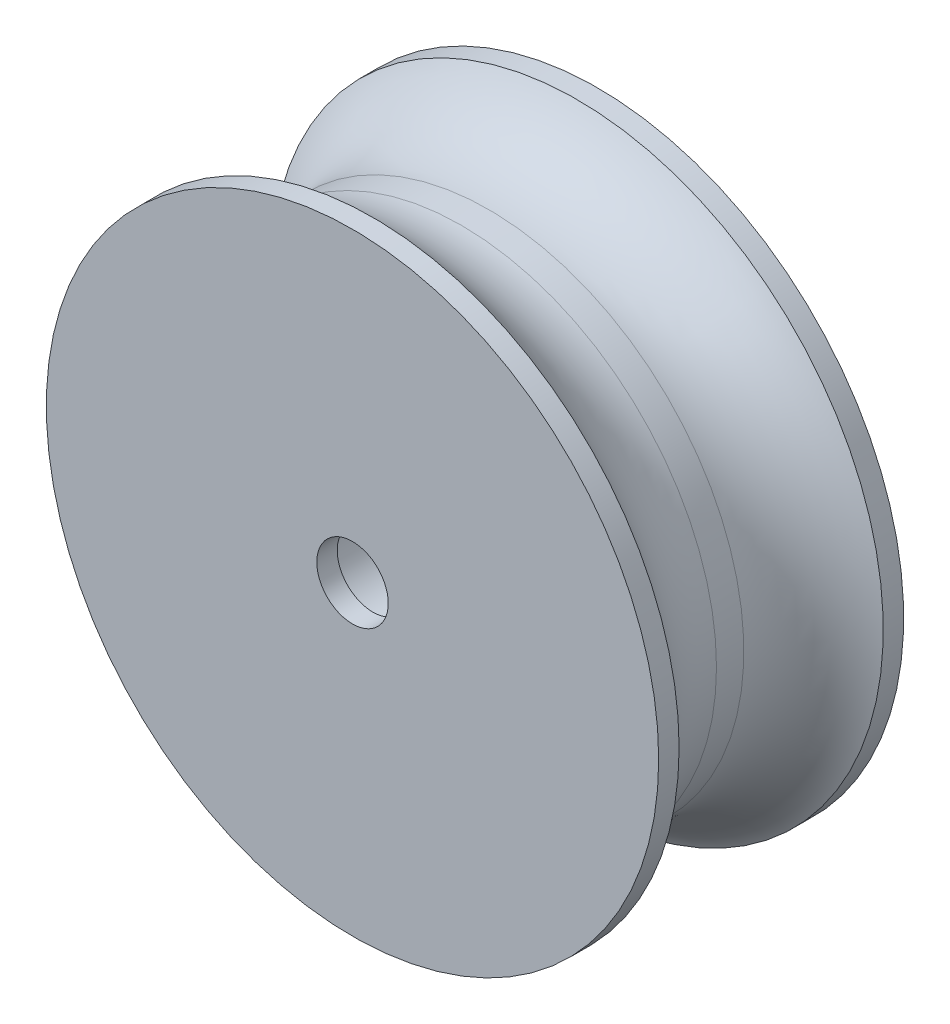
ISO-10303-21;
HEADER;
FILE_DESCRIPTION(('STEP AP214'),'2;1');
FILE_NAME('part.step','',(''),(''),'','','');
FILE_SCHEMA(('AUTOMOTIVE_DESIGN { 1 0 10303 214 1 1 1 1 }'));
ENDSEC;
DATA;
#1=APPLICATION_CONTEXT('core data for automotive mechanical design processes');
#2=APPLICATION_PROTOCOL_DEFINITION('international standard','automotive_design',2000,#1);
#3=PRODUCT_CONTEXT('',#1,'mechanical');
#4=PRODUCT('Part','Part','',(#3));
#5=PRODUCT_RELATED_PRODUCT_CATEGORY('part','',(#4));
#6=PRODUCT_DEFINITION_FORMATION('','',#4);
#7=PRODUCT_DEFINITION_CONTEXT('part definition',#1,'design');
#8=PRODUCT_DEFINITION('design','',#6,#7);
#9=PRODUCT_DEFINITION_SHAPE('','',#8);
#10=(LENGTH_UNIT() NAMED_UNIT(*) SI_UNIT(.MILLI.,.METRE.));
#11=(NAMED_UNIT(*) PLANE_ANGLE_UNIT() SI_UNIT($,.RADIAN.));
#12=(NAMED_UNIT(*) SI_UNIT($,.STERADIAN.) SOLID_ANGLE_UNIT());
#13=UNCERTAINTY_MEASURE_WITH_UNIT(LENGTH_MEASURE(1.E-05),#10,'distance_accuracy_value','');
#14=(GEOMETRIC_REPRESENTATION_CONTEXT(3) GLOBAL_UNCERTAINTY_ASSIGNED_CONTEXT((#13)) GLOBAL_UNIT_ASSIGNED_CONTEXT((#10,
#11,#12)) REPRESENTATION_CONTEXT('',''));
#15=CARTESIAN_POINT('',(0.,0.,0.));
#16=DIRECTION('',(0.,0.,1.));
#17=DIRECTION('',(1.,0.,0.));
#18=AXIS2_PLACEMENT_3D('',#15,#16,#17);
#19=CARTESIAN_POINT('',(0.,0.,10.));
#20=DIRECTION('',(0.,0.,-1.));
#21=DIRECTION('',(-1.,0.,0.));
#22=AXIS2_PLACEMENT_3D('',#19,#20,#21);
#23=CYLINDRICAL_SURFACE('',#22,12.5);
#24=CARTESIAN_POINT('',(0.,0.,4.33012701892219));
#25=DIRECTION('',(0.,0.,-1.));
#26=DIRECTION('',(-1.,0.,0.));
#27=AXIS2_PLACEMENT_3D('',#24,#25,#26);
#28=CIRCLE('',#27,12.5);
#29=CARTESIAN_POINT('',(-12.5,0.,4.33012701892219));
#30=VERTEX_POINT('',#29);
#31=EDGE_CURVE('E10',#30,#30,#28,.F.);
#32=ORIENTED_EDGE('',*,*,#31,.T.);
#33=EDGE_LOOP('',(#32));
#34=FACE_BOUND('',#33,.T.);
#35=CARTESIAN_POINT('',(0.,0.,5.66987298107781));
#36=DIRECTION('',(0.,0.,1.));
#37=DIRECTION('',(1.,0.,0.));
#38=AXIS2_PLACEMENT_3D('',#35,#36,#37);
#39=CIRCLE('',#38,12.5);
#40=CARTESIAN_POINT('',(12.5,0.,5.66987298107781));
#41=VERTEX_POINT('',#40);
#42=EDGE_CURVE('E40',#41,#41,#39,.F.);
#43=ORIENTED_EDGE('',*,*,#42,.T.);
#44=EDGE_LOOP('',(#43));
#45=FACE_BOUND('',#44,.T.);
#46=ADVANCED_FACE('F33',(#34,#45),#23,.T.);
#47=CARTESIAN_POINT('',(0.,0.,-1.));
#48=DIRECTION('',(0.,0.,1.));
#49=DIRECTION('',(1.,0.,0.));
#50=AXIS2_PLACEMENT_3D('',#47,#48,#49);
#51=CYLINDRICAL_SURFACE('',#50,15.);
#52=CARTESIAN_POINT('',(0.,0.,-1.));
#53=DIRECTION('',(0.,0.,-1.));
#54=DIRECTION('',(-1.,0.,0.));
#55=AXIS2_PLACEMENT_3D('',#52,#53,#54);
#56=CIRCLE('',#55,15.);
#57=CARTESIAN_POINT('',(-15.,0.,-1.));
#58=VERTEX_POINT('',#57);
#59=EDGE_CURVE('E48',#58,#58,#56,.T.);
#60=ORIENTED_EDGE('',*,*,#59,.F.);
#61=EDGE_LOOP('',(#60));
#62=FACE_BOUND('',#61,.T.);
#63=CARTESIAN_POINT('',(0.,0.,0.));
#64=DIRECTION('',(0.,0.,-1.));
#65=DIRECTION('',(-1.,0.,0.));
#66=AXIS2_PLACEMENT_3D('',#63,#64,#65);
#67=CIRCLE('',#66,15.);
#68=CARTESIAN_POINT('',(-15.,0.,0.));
#69=VERTEX_POINT('',#68);
#70=EDGE_CURVE('E56',#69,#69,#67,.T.);
#71=ORIENTED_EDGE('',*,*,#70,.T.);
#72=EDGE_LOOP('',(#71));
#73=FACE_BOUND('',#72,.T.);
#74=ADVANCED_FACE('F112',(#62,#73),#51,.T.);
#75=CARTESIAN_POINT('',(0.,0.,-1.));
#76=DIRECTION('',(0.,0.,-1.));
#77=DIRECTION('',(-1.,0.,0.));
#78=AXIS2_PLACEMENT_3D('',#75,#76,#77);
#79=PLANE('',#78);
#80=CARTESIAN_POINT('',(0.,0.,-1.));
#81=DIRECTION('',(0.,0.,1.));
#82=DIRECTION('',(1.,0.,0.));
#83=AXIS2_PLACEMENT_3D('',#80,#81,#82);
#84=CIRCLE('',#83,1.75);
#85=CARTESIAN_POINT('',(1.75,0.,-1.));
#86=VERTEX_POINT('',#85);
#87=EDGE_CURVE('E54',#86,#86,#84,.T.);
#88=ORIENTED_EDGE('',*,*,#87,.T.);
#89=EDGE_LOOP('',(#88));
#90=FACE_BOUND('',#89,.T.);
#91=ORIENTED_EDGE('',*,*,#59,.T.);
#92=EDGE_LOOP('',(#91));
#93=FACE_BOUND('',#92,.T.);
#94=ADVANCED_FACE('F78',(#90,#93),#79,.T.);
#95=CARTESIAN_POINT('',(0.,0.,11.));
#96=DIRECTION('',(0.,0.,-1.));
#97=DIRECTION('',(-1.,0.,0.));
#98=AXIS2_PLACEMENT_3D('',#95,#96,#97);
#99=CYLINDRICAL_SURFACE('',#98,15.);
#100=CARTESIAN_POINT('',(0.,0.,11.));
#101=DIRECTION('',(0.,0.,1.));
#102=DIRECTION('',(1.,0.,0.));
#103=AXIS2_PLACEMENT_3D('',#100,#101,#102);
#104=CIRCLE('',#103,15.);
#105=CARTESIAN_POINT('',(15.,0.,11.));
#106=VERTEX_POINT('',#105);
#107=EDGE_CURVE('E64',#106,#106,#104,.T.);
#108=ORIENTED_EDGE('',*,*,#107,.F.);
#109=EDGE_LOOP('',(#108));
#110=FACE_BOUND('',#109,.T.);
#111=CARTESIAN_POINT('',(0.,0.,10.));
#112=DIRECTION('',(0.,0.,1.));
#113=DIRECTION('',(1.,0.,0.));
#114=AXIS2_PLACEMENT_3D('',#111,#112,#113);
#115=CIRCLE('',#114,15.);
#116=CARTESIAN_POINT('',(15.,0.,10.));
#117=VERTEX_POINT('',#116);
#118=EDGE_CURVE('E65',#117,#117,#115,.T.);
#119=ORIENTED_EDGE('',*,*,#118,.T.);
#120=EDGE_LOOP('',(#119));
#121=FACE_BOUND('',#120,.T.);
#122=ADVANCED_FACE('F121',(#110,#121),#99,.T.);
#123=CARTESIAN_POINT('',(0.,0.,11.));
#124=DIRECTION('',(0.,0.,1.));
#125=DIRECTION('',(1.,0.,0.));
#126=AXIS2_PLACEMENT_3D('',#123,#124,#125);
#127=PLANE('',#126);
#128=CARTESIAN_POINT('',(0.,0.,11.));
#129=DIRECTION('',(0.,0.,1.));
#130=DIRECTION('',(1.,0.,0.));
#131=AXIS2_PLACEMENT_3D('',#128,#129,#130);
#132=CIRCLE('',#131,1.75);
#133=CARTESIAN_POINT('',(1.75,0.,11.));
#134=VERTEX_POINT('',#133);
#135=EDGE_CURVE('E72',#134,#134,#132,.T.);
#136=ORIENTED_EDGE('',*,*,#135,.F.);
#137=EDGE_LOOP('',(#136));
#138=FACE_BOUND('',#137,.T.);
#139=ORIENTED_EDGE('',*,*,#107,.T.);
#140=EDGE_LOOP('',(#139));
#141=FACE_BOUND('',#140,.T.);
#142=ADVANCED_FACE('F123',(#138,#141),#127,.T.);
#143=CARTESIAN_POINT('',(0.,0.,-1.));
#144=DIRECTION('',(0.,0.,1.));
#145=DIRECTION('',(1.,0.,0.));
#146=AXIS2_PLACEMENT_3D('',#143,#144,#145);
#147=CYLINDRICAL_SURFACE('',#146,1.75);
#148=ORIENTED_EDGE('',*,*,#135,.T.);
#149=EDGE_LOOP('',(#148));
#150=FACE_BOUND('',#149,.T.);
#151=CARTESIAN_POINT('',(0.,0.,10.));
#152=DIRECTION('',(0.,0.,1.));
#153=DIRECTION('',(1.,0.,0.));
#154=AXIS2_PLACEMENT_3D('',#151,#152,#153);
#155=CIRCLE('',#154,1.75);
#156=CARTESIAN_POINT('',(1.75,0.,10.));
#157=VERTEX_POINT('',#156);
#158=EDGE_CURVE('E51',#157,#157,#155,.T.);
#159=ORIENTED_EDGE('',*,*,#158,.F.);
#160=EDGE_LOOP('',(#159));
#161=FACE_BOUND('',#160,.T.);
#162=ADVANCED_FACE('F85',(#150,#161),#147,.F.);
#163=ORIENTED_EDGE('',*,*,#87,.F.);
#164=EDGE_LOOP('',(#163));
#165=FACE_BOUND('',#164,.T.);
#166=CARTESIAN_POINT('',(0.,0.,0.));
#167=DIRECTION('',(0.,0.,-1.));
#168=DIRECTION('',(-1.,0.,0.));
#169=AXIS2_PLACEMENT_3D('',#166,#167,#168);
#170=CIRCLE('',#169,1.75);
#171=CARTESIAN_POINT('',(-1.75,0.,0.));
#172=VERTEX_POINT('',#171);
#173=EDGE_CURVE('E53',#172,#172,#170,.T.);
#174=ORIENTED_EDGE('',*,*,#173,.F.);
#175=EDGE_LOOP('',(#174));
#176=FACE_BOUND('',#175,.T.);
#177=ADVANCED_FACE('F81',(#165,#176),#147,.F.);
#178=CARTESIAN_POINT('',(0.,0.,0.));
#179=DIRECTION('',(0.,0.,-1.));
#180=DIRECTION('',(-1.,0.,0.));
#181=AXIS2_PLACEMENT_3D('',#178,#179,#180);
#182=PLANE('',#181);
#183=ORIENTED_EDGE('',*,*,#173,.T.);
#184=EDGE_LOOP('',(#183));
#185=FACE_BOUND('',#184,.T.);
#186=CARTESIAN_POINT('',(0.,0.,0.));
#187=DIRECTION('',(0.,0.,1.));
#188=DIRECTION('',(1.,0.,0.));
#189=AXIS2_PLACEMENT_3D('',#186,#187,#188);
#190=CIRCLE('',#189,2.5908);
#191=CARTESIAN_POINT('',(2.5908,0.,0.));
#192=VERTEX_POINT('',#191);
#193=EDGE_CURVE('E44',#192,#192,#190,.T.);
#194=ORIENTED_EDGE('',*,*,#193,.T.);
#195=EDGE_LOOP('',(#194));
#196=FACE_BOUND('',#195,.T.);
#197=ADVANCED_FACE('F84',(#185,#196),#182,.F.);
#198=CARTESIAN_POINT('',(0.,0.,10.));
#199=DIRECTION('',(0.,0.,1.));
#200=DIRECTION('',(1.,0.,0.));
#201=AXIS2_PLACEMENT_3D('',#198,#199,#200);
#202=CYLINDRICAL_SURFACE('',#201,2.59079999999999);
#203=ORIENTED_EDGE('',*,*,#193,.F.);
#204=EDGE_LOOP('',(#203));
#205=FACE_BOUND('',#204,.T.);
#206=CARTESIAN_POINT('',(0.,0.,10.));
#207=DIRECTION('',(0.,0.,1.));
#208=DIRECTION('',(1.,0.,0.));
#209=AXIS2_PLACEMENT_3D('',#206,#207,#208);
#210=CIRCLE('',#209,2.59079999999999);
#211=CARTESIAN_POINT('',(2.59079999999999,0.,10.));
#212=VERTEX_POINT('',#211);
#213=EDGE_CURVE('E59',#212,#212,#210,.F.);
#214=ORIENTED_EDGE('',*,*,#213,.F.);
#215=EDGE_LOOP('',(#214));
#216=FACE_BOUND('',#215,.T.);
#217=ADVANCED_FACE('F91',(#205,#216),#202,.F.);
#218=CARTESIAN_POINT('',(0.,0.,10.));
#219=DIRECTION('',(0.,0.,1.));
#220=DIRECTION('',(1.,0.,0.));
#221=AXIS2_PLACEMENT_3D('',#218,#219,#220);
#222=PLANE('',#221);
#223=ORIENTED_EDGE('',*,*,#158,.T.);
#224=EDGE_LOOP('',(#223));
#225=FACE_BOUND('',#224,.T.);
#226=ORIENTED_EDGE('',*,*,#213,.T.);
#227=EDGE_LOOP('',(#226));
#228=FACE_BOUND('',#227,.T.);
#229=ADVANCED_FACE('F97',(#225,#228),#222,.F.);
#230=CARTESIAN_POINT('',(0.,0.,5.66987298107781));
#231=DIRECTION('',(0.,0.,1.));
#232=DIRECTION('',(1.,0.,0.));
#233=AXIS2_PLACEMENT_3D('',#230,#231,#232);
#234=TOROIDAL_SURFACE('',#233,17.5,5.);
#235=ORIENTED_EDGE('',*,*,#42,.F.);
#236=EDGE_LOOP('',(#235));
#237=FACE_BOUND('',#236,.T.);
#238=ORIENTED_EDGE('',*,*,#118,.F.);
#239=EDGE_LOOP('',(#238));
#240=FACE_BOUND('',#239,.T.);
#241=ADVANCED_FACE('F102',(#237,#240),#234,.F.);
#242=CARTESIAN_POINT('',(0.,0.,4.33012701892219));
#243=DIRECTION('',(0.,0.,-1.));
#244=DIRECTION('',(-1.,0.,0.));
#245=AXIS2_PLACEMENT_3D('',#242,#243,#244);
#246=TOROIDAL_SURFACE('',#245,17.5,5.);
#247=ORIENTED_EDGE('',*,*,#31,.F.);
#248=EDGE_LOOP('',(#247));
#249=FACE_BOUND('',#248,.T.);
#250=ORIENTED_EDGE('',*,*,#70,.F.);
#251=EDGE_LOOP('',(#250));
#252=FACE_BOUND('',#251,.T.);
#253=ADVANCED_FACE('F35',(#249,#252),#246,.F.);
#254=CLOSED_SHELL('',(#46,#74,#94,#122,#142,#162,#177,#197,#217,#229,#241,#253));
#255=MANIFOLD_SOLID_BREP('B2',#254);
#256=ADVANCED_BREP_SHAPE_REPRESENTATION('',(#18,#255),#14);
#257=SHAPE_DEFINITION_REPRESENTATION(#9,#256);
ENDSEC;
END-ISO-10303-21;
